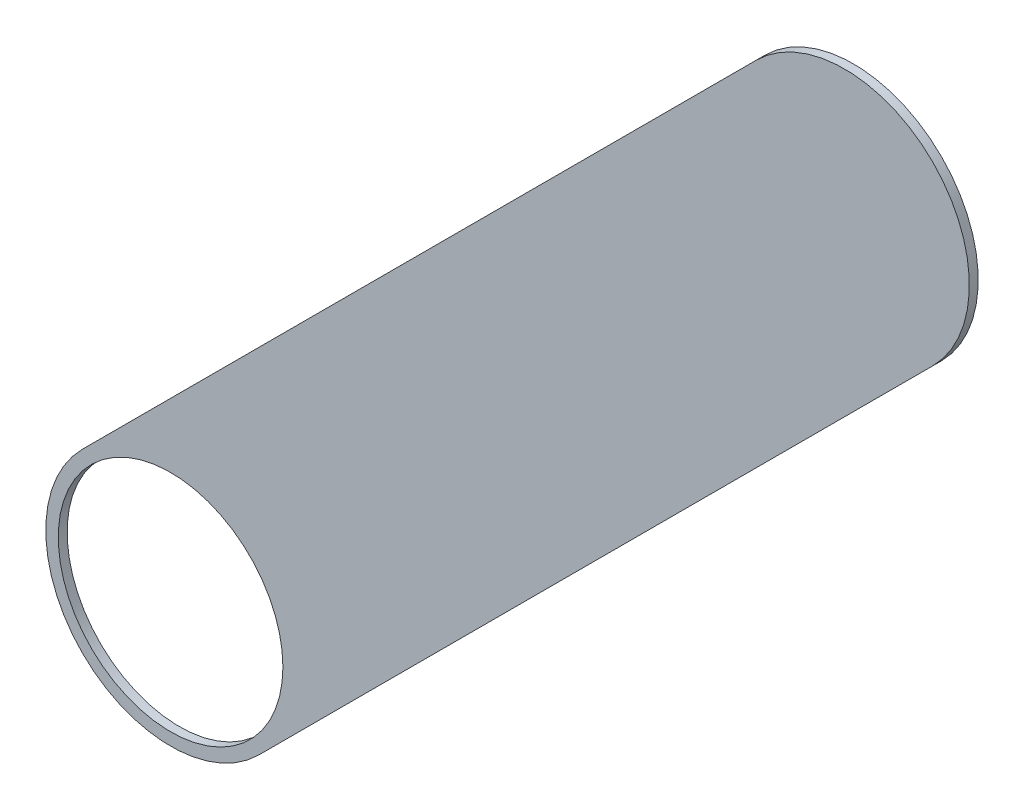
ISO-10303-21;
HEADER;
FILE_DESCRIPTION(('STEP AP214'),'2;1');
FILE_NAME('part.step','',(''),(''),'','','');
FILE_SCHEMA(('AUTOMOTIVE_DESIGN { 1 0 10303 214 1 1 1 1 }'));
ENDSEC;
DATA;
#1=APPLICATION_CONTEXT('core data for automotive mechanical design processes');
#2=APPLICATION_PROTOCOL_DEFINITION('international standard','automotive_design',2000,#1);
#3=PRODUCT_CONTEXT('',#1,'mechanical');
#4=PRODUCT('Part','Part','',(#3));
#5=PRODUCT_RELATED_PRODUCT_CATEGORY('part','',(#4));
#6=PRODUCT_DEFINITION_FORMATION('','',#4);
#7=PRODUCT_DEFINITION_CONTEXT('part definition',#1,'design');
#8=PRODUCT_DEFINITION('design','',#6,#7);
#9=PRODUCT_DEFINITION_SHAPE('','',#8);
#10=(LENGTH_UNIT() NAMED_UNIT(*) SI_UNIT(.MILLI.,.METRE.));
#11=(NAMED_UNIT(*) PLANE_ANGLE_UNIT() SI_UNIT($,.RADIAN.));
#12=(NAMED_UNIT(*) SI_UNIT($,.STERADIAN.) SOLID_ANGLE_UNIT());
#13=UNCERTAINTY_MEASURE_WITH_UNIT(LENGTH_MEASURE(1.E-05),#10,'distance_accuracy_value','');
#14=(GEOMETRIC_REPRESENTATION_CONTEXT(3) GLOBAL_UNCERTAINTY_ASSIGNED_CONTEXT((#13)) GLOBAL_UNIT_ASSIGNED_CONTEXT((#10,
#11,#12)) REPRESENTATION_CONTEXT('',''));
#15=CARTESIAN_POINT('',(0.,0.,0.));
#16=DIRECTION('',(0.,0.,1.));
#17=DIRECTION('',(1.,0.,0.));
#18=AXIS2_PLACEMENT_3D('',#15,#16,#17);
#19=CARTESIAN_POINT('',(117.55357236,52.10643884,0.));
#20=DIRECTION('',(-0.707106781186548,0.707106781186548,0.));
#21=DIRECTION('',(0.707106781186548,0.707106781186548,0.));
#22=AXIS2_PLACEMENT_3D('',#19,#20,#21);
#23=PLANE('',#22);
#24=DIRECTION('',(0.707106781186548,0.707106781186548,0.));
#25=VECTOR('',#24,1.);
#26=CARTESIAN_POINT('',(117.55357236,52.10643884,0.03556));
#27=LINE('',#26,#25);
#28=CARTESIAN_POINT('',(117.55357236,52.10643884,0.03556));
#29=VERTEX_POINT('',#28);
#30=CARTESIAN_POINT('',(120.25355172,54.8064182,0.03556));
#31=VERTEX_POINT('',#30);
#32=EDGE_CURVE('E11',#29,#31,#27,.T.);
#33=ORIENTED_EDGE('',*,*,#32,.F.);
#34=DIRECTION('',(0.,0.,1.));
#35=VECTOR('',#34,1.);
#36=CARTESIAN_POINT('',(117.55357236,52.10643884,0.));
#37=LINE('',#36,#35);
#38=CARTESIAN_POINT('',(117.55357236,52.10643884,0.));
#39=VERTEX_POINT('',#38);
#40=EDGE_CURVE('E24',#39,#29,#37,.T.);
#41=ORIENTED_EDGE('',*,*,#40,.F.);
#42=DIRECTION('',(0.707106781186548,0.707106781186548,0.));
#43=VECTOR('',#42,1.);
#44=CARTESIAN_POINT('',(117.55357236,52.10643884,0.));
#45=LINE('',#44,#43);
#46=CARTESIAN_POINT('',(120.25355172,54.8064182,0.));
#47=VERTEX_POINT('',#46);
#48=EDGE_CURVE('E96',#39,#47,#45,.T.);
#49=ORIENTED_EDGE('',*,*,#48,.T.);
#50=DIRECTION('',(0.,0.,1.));
#51=VECTOR('',#50,1.);
#52=CARTESIAN_POINT('',(120.25355172,54.8064182,0.));
#53=LINE('',#52,#51);
#54=EDGE_CURVE('E37',#47,#31,#53,.T.);
#55=ORIENTED_EDGE('',*,*,#54,.T.);
#56=EDGE_LOOP('',(#33,#41,#49,#55));
#57=FACE_BOUND('',#56,.T.);
#58=ADVANCED_FACE('F17',(#57),#23,.F.);
#59=CARTESIAN_POINT('',(117.2000196,52.4599916,0.));
#60=DIRECTION('',(0.,0.,-1.));
#61=DIRECTION('',(-0.707106781186548,0.707106781186548,0.));
#62=AXIS2_PLACEMENT_3D('',#59,#60,#61);
#63=CYLINDRICAL_SURFACE('',#62,0.499999108206439);
#64=CARTESIAN_POINT('',(117.2000196,52.4599916,0.03556));
#65=DIRECTION('',(0.,0.,1.));
#66=DIRECTION('',(-0.707106781186548,0.707106781186548,0.));
#67=AXIS2_PLACEMENT_3D('',#64,#65,#66);
#68=CIRCLE('',#67,0.499999108206439);
#69=CARTESIAN_POINT('',(116.84646684,52.81354436,0.03556));
#70=VERTEX_POINT('',#69);
#71=EDGE_CURVE('E92',#70,#29,#68,.T.);
#72=ORIENTED_EDGE('',*,*,#71,.F.);
#73=DIRECTION('',(0.,0.,1.));
#74=VECTOR('',#73,1.);
#75=CARTESIAN_POINT('',(116.84646684,52.81354436,0.));
#76=LINE('',#75,#74);
#77=CARTESIAN_POINT('',(116.84646684,52.81354436,0.));
#78=VERTEX_POINT('',#77);
#79=EDGE_CURVE('E90',#78,#70,#76,.T.);
#80=ORIENTED_EDGE('',*,*,#79,.F.);
#81=CARTESIAN_POINT('',(117.2000196,52.4599916,0.));
#82=DIRECTION('',(0.,0.,1.));
#83=DIRECTION('',(-0.707106781186548,0.707106781186548,0.));
#84=AXIS2_PLACEMENT_3D('',#81,#82,#83);
#85=CIRCLE('',#84,0.499999108206439);
#86=EDGE_CURVE('E88',#78,#39,#85,.T.);
#87=ORIENTED_EDGE('',*,*,#86,.T.);
#88=ORIENTED_EDGE('',*,*,#40,.T.);
#89=EDGE_LOOP('',(#72,#80,#87,#88));
#90=FACE_BOUND('',#89,.T.);
#91=ADVANCED_FACE('F111',(#90),#63,.T.);
#92=CARTESIAN_POINT('',(119.89999896,55.15997096,0.));
#93=DIRECTION('',(0.,0.,-1.));
#94=DIRECTION('',(0.70710678118654,-0.707106781186555,0.));
#95=AXIS2_PLACEMENT_3D('',#92,#93,#94);
#96=CYLINDRICAL_SURFACE('',#95,0.499999108206431);
#97=CARTESIAN_POINT('',(119.89999896,55.15997096,0.03556));
#98=DIRECTION('',(0.,0.,1.));
#99=DIRECTION('',(0.70710678118654,-0.707106781186555,0.));
#100=AXIS2_PLACEMENT_3D('',#97,#98,#99);
#101=CIRCLE('',#100,0.499999108206431);
#102=CARTESIAN_POINT('',(119.5464462,55.51352372,0.03556));
#103=VERTEX_POINT('',#102);
#104=EDGE_CURVE('E85',#31,#103,#101,.T.);
#105=ORIENTED_EDGE('',*,*,#104,.F.);
#106=ORIENTED_EDGE('',*,*,#54,.F.);
#107=CARTESIAN_POINT('',(119.89999896,55.15997096,0.));
#108=DIRECTION('',(0.,0.,1.));
#109=DIRECTION('',(0.70710678118654,-0.707106781186555,0.));
#110=AXIS2_PLACEMENT_3D('',#107,#108,#109);
#111=CIRCLE('',#110,0.499999108206431);
#112=CARTESIAN_POINT('',(119.5464462,55.51352372,0.));
#113=VERTEX_POINT('',#112);
#114=EDGE_CURVE('E82',#47,#113,#111,.T.);
#115=ORIENTED_EDGE('',*,*,#114,.T.);
#116=DIRECTION('',(0.,0.,1.));
#117=VECTOR('',#116,1.);
#118=CARTESIAN_POINT('',(119.5464462,55.51352372,0.));
#119=LINE('',#118,#117);
#120=EDGE_CURVE('E80',#113,#103,#119,.T.);
#121=ORIENTED_EDGE('',*,*,#120,.T.);
#122=EDGE_LOOP('',(#105,#106,#115,#121));
#123=FACE_BOUND('',#122,.T.);
#124=ADVANCED_FACE('F104',(#123),#96,.T.);
#125=CARTESIAN_POINT('',(119.5464462,55.51352372,0.));
#126=DIRECTION('',(0.707106781186545,-0.70710678118655,0.));
#127=DIRECTION('',(-0.70710678118655,-0.707106781186545,0.));
#128=AXIS2_PLACEMENT_3D('',#125,#126,#127);
#129=PLANE('',#128);
#130=DIRECTION('',(-0.70710678118655,-0.707106781186545,0.));
#131=VECTOR('',#130,1.);
#132=CARTESIAN_POINT('',(119.5464462,55.51352372,0.03556));
#133=LINE('',#132,#131);
#134=EDGE_CURVE('E77',#103,#70,#133,.T.);
#135=ORIENTED_EDGE('',*,*,#134,.F.);
#136=ORIENTED_EDGE('',*,*,#120,.F.);
#137=DIRECTION('',(-0.70710678118655,-0.707106781186545,0.));
#138=VECTOR('',#137,1.);
#139=CARTESIAN_POINT('',(119.5464462,55.51352372,0.));
#140=LINE('',#139,#138);
#141=EDGE_CURVE('E68',#113,#78,#140,.T.);
#142=ORIENTED_EDGE('',*,*,#141,.T.);
#143=ORIENTED_EDGE('',*,*,#79,.T.);
#144=EDGE_LOOP('',(#135,#136,#142,#143));
#145=FACE_BOUND('',#144,.T.);
#146=ADVANCED_FACE('F110',(#145),#129,.F.);
#147=CARTESIAN_POINT('',(117.2000196,52.4599916,0.));
#148=DIRECTION('',(0.,0.,-1.));
#149=DIRECTION('',(1.,0.,0.));
#150=AXIS2_PLACEMENT_3D('',#147,#148,#149);
#151=CYLINDRICAL_SURFACE('',#150,0.4499991);
#152=DIRECTION('',(0.,0.,1.));
#153=VECTOR('',#152,1.);
#154=CARTESIAN_POINT('',(117.6500187,52.4599916,0.));
#155=LINE('',#154,#153);
#156=CARTESIAN_POINT('',(117.6500187,52.4599916,0.));
#157=VERTEX_POINT('',#156);
#158=CARTESIAN_POINT('',(117.6500187,52.4599916,0.03556));
#159=VERTEX_POINT('',#158);
#160=EDGE_CURVE('E62',#157,#159,#155,.T.);
#161=ORIENTED_EDGE('',*,*,#160,.T.);
#162=CARTESIAN_POINT('',(117.2000196,52.4599916,0.03556));
#163=DIRECTION('',(0.,0.,1.));
#164=DIRECTION('',(1.,0.,0.));
#165=AXIS2_PLACEMENT_3D('',#162,#163,#164);
#166=CIRCLE('',#165,0.4499991);
#167=EDGE_CURVE('E67',#159,#159,#166,.T.);
#168=ORIENTED_EDGE('',*,*,#167,.T.);
#169=ORIENTED_EDGE('',*,*,#160,.F.);
#170=CARTESIAN_POINT('',(117.2000196,52.4599916,0.));
#171=DIRECTION('',(0.,0.,1.));
#172=DIRECTION('',(1.,0.,0.));
#173=AXIS2_PLACEMENT_3D('',#170,#171,#172);
#174=CIRCLE('',#173,0.4499991);
#175=EDGE_CURVE('E65',#157,#157,#174,.T.);
#176=ORIENTED_EDGE('',*,*,#175,.F.);
#177=EDGE_LOOP('',(#161,#168,#169,#176));
#178=FACE_BOUND('',#177,.T.);
#179=ADVANCED_FACE('F64',(#178),#151,.F.);
#180=CARTESIAN_POINT('',(117.55357236,52.10643884,0.));
#181=DIRECTION('',(0.,0.,-1.));
#182=DIRECTION('',(-1.,0.,0.));
#183=AXIS2_PLACEMENT_3D('',#180,#181,#182);
#184=PLANE('',#183);
#185=ORIENTED_EDGE('',*,*,#48,.F.);
#186=ORIENTED_EDGE('',*,*,#86,.F.);
#187=ORIENTED_EDGE('',*,*,#141,.F.);
#188=ORIENTED_EDGE('',*,*,#114,.F.);
#189=EDGE_LOOP('',(#185,#186,#187,#188));
#190=FACE_BOUND('',#189,.T.);
#191=ORIENTED_EDGE('',*,*,#175,.T.);
#192=EDGE_LOOP('',(#191));
#193=FACE_BOUND('',#192,.T.);
#194=ADVANCED_FACE('F71',(#190,#193),#184,.T.);
#195=CARTESIAN_POINT('',(117.55357236,52.10643884,0.03556));
#196=DIRECTION('',(0.,0.,-1.));
#197=DIRECTION('',(-1.,0.,0.));
#198=AXIS2_PLACEMENT_3D('',#195,#196,#197);
#199=PLANE('',#198);
#200=ORIENTED_EDGE('',*,*,#134,.T.);
#201=ORIENTED_EDGE('',*,*,#71,.T.);
#202=ORIENTED_EDGE('',*,*,#32,.T.);
#203=ORIENTED_EDGE('',*,*,#104,.T.);
#204=EDGE_LOOP('',(#200,#201,#202,#203));
#205=FACE_BOUND('',#204,.T.);
#206=ORIENTED_EDGE('',*,*,#167,.F.);
#207=EDGE_LOOP('',(#206));
#208=FACE_BOUND('',#207,.T.);
#209=ADVANCED_FACE('F107',(#205,#208),#199,.F.);
#210=CLOSED_SHELL('',(#58,#91,#124,#146,#179,#194,#209));
#211=MANIFOLD_SOLID_BREP('B1',#210);
#212=ADVANCED_BREP_SHAPE_REPRESENTATION('',(#18,#211),#14);
#213=SHAPE_DEFINITION_REPRESENTATION(#9,#212);
ENDSEC;
END-ISO-10303-21;
